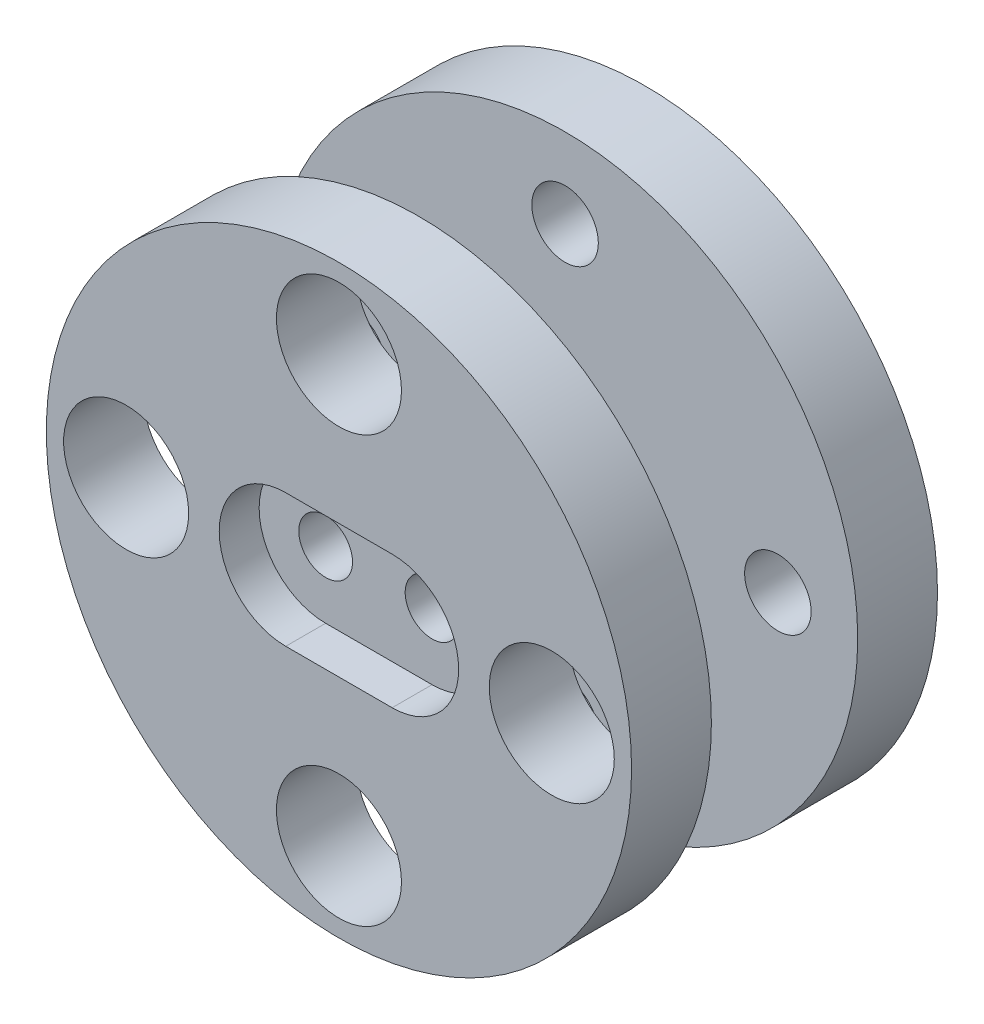
ISO-10303-21;
HEADER;
FILE_DESCRIPTION(('STEP AP214'),'2;1');
FILE_NAME('part.step','',(''),(''),'','','');
FILE_SCHEMA(('AUTOMOTIVE_DESIGN { 1 0 10303 214 1 1 1 1 }'));
ENDSEC;
DATA;
#1=APPLICATION_CONTEXT('core data for automotive mechanical design processes');
#2=APPLICATION_PROTOCOL_DEFINITION('international standard','automotive_design',2000,#1);
#3=PRODUCT_CONTEXT('',#1,'mechanical');
#4=PRODUCT('Part','Part','',(#3));
#5=PRODUCT_RELATED_PRODUCT_CATEGORY('part','',(#4));
#6=PRODUCT_DEFINITION_FORMATION('','',#4);
#7=PRODUCT_DEFINITION_CONTEXT('part definition',#1,'design');
#8=PRODUCT_DEFINITION('design','',#6,#7);
#9=PRODUCT_DEFINITION_SHAPE('','',#8);
#10=(LENGTH_UNIT() NAMED_UNIT(*) SI_UNIT(.MILLI.,.METRE.));
#11=(NAMED_UNIT(*) PLANE_ANGLE_UNIT() SI_UNIT($,.RADIAN.));
#12=(NAMED_UNIT(*) SI_UNIT($,.STERADIAN.) SOLID_ANGLE_UNIT());
#13=UNCERTAINTY_MEASURE_WITH_UNIT(LENGTH_MEASURE(1.E-05),#10,'distance_accuracy_value','');
#14=(GEOMETRIC_REPRESENTATION_CONTEXT(3) GLOBAL_UNCERTAINTY_ASSIGNED_CONTEXT((#13)) GLOBAL_UNIT_ASSIGNED_CONTEXT((#10,
#11,#12)) REPRESENTATION_CONTEXT('',''));
#15=CARTESIAN_POINT('',(0.,0.,0.));
#16=DIRECTION('',(0.,0.,1.));
#17=DIRECTION('',(1.,0.,0.));
#18=AXIS2_PLACEMENT_3D('',#15,#16,#17);
#19=CARTESIAN_POINT('',(2.,0.,0.143288604006347));
#20=DIRECTION('',(0.,0.,1.));
#21=DIRECTION('',(1.,0.,0.));
#22=AXIS2_PLACEMENT_3D('',#19,#20,#21);
#23=CYLINDRICAL_SURFACE('',#22,1.01);
#24=CARTESIAN_POINT('',(2.,0.,8.5));
#25=DIRECTION('',(0.,0.,1.));
#26=DIRECTION('',(1.,0.,0.));
#27=AXIS2_PLACEMENT_3D('',#24,#25,#26);
#28=CIRCLE('',#27,1.01);
#29=CARTESIAN_POINT('',(3.01,0.,8.5));
#30=VERTEX_POINT('',#29);
#31=EDGE_CURVE('E125',#30,#30,#28,.T.);
#32=ORIENTED_EDGE('',*,*,#31,.F.);
#33=EDGE_LOOP('',(#32));
#34=FACE_BOUND('',#33,.T.);
#35=CARTESIAN_POINT('',(2.,0.,10.));
#36=DIRECTION('',(0.,0.,1.));
#37=DIRECTION('',(1.,0.,0.));
#38=AXIS2_PLACEMENT_3D('',#35,#36,#37);
#39=CIRCLE('',#38,1.01);
#40=CARTESIAN_POINT('',(3.01,0.,10.));
#41=VERTEX_POINT('',#40);
#42=EDGE_CURVE('E122',#41,#41,#39,.F.);
#43=ORIENTED_EDGE('',*,*,#42,.F.);
#44=EDGE_LOOP('',(#43));
#45=FACE_BOUND('',#44,.T.);
#46=ADVANCED_FACE('F44',(#34,#45),#23,.F.);
#47=CARTESIAN_POINT('',(-2.,0.,0.143288604006347));
#48=DIRECTION('',(0.,0.,1.));
#49=DIRECTION('',(1.,0.,0.));
#50=AXIS2_PLACEMENT_3D('',#47,#48,#49);
#51=CYLINDRICAL_SURFACE('',#50,1.01);
#52=CARTESIAN_POINT('',(-2.,0.,8.5));
#53=DIRECTION('',(0.,0.,1.));
#54=DIRECTION('',(1.,0.,0.));
#55=AXIS2_PLACEMENT_3D('',#52,#53,#54);
#56=CIRCLE('',#55,1.01);
#57=CARTESIAN_POINT('',(-0.99,0.,8.5));
#58=VERTEX_POINT('',#57);
#59=EDGE_CURVE('E133',#58,#58,#56,.T.);
#60=ORIENTED_EDGE('',*,*,#59,.F.);
#61=EDGE_LOOP('',(#60));
#62=FACE_BOUND('',#61,.T.);
#63=CARTESIAN_POINT('',(-2.,0.,10.));
#64=DIRECTION('',(0.,0.,1.));
#65=DIRECTION('',(1.,0.,0.));
#66=AXIS2_PLACEMENT_3D('',#63,#64,#65);
#67=CIRCLE('',#66,1.01);
#68=CARTESIAN_POINT('',(-0.99,0.,10.));
#69=VERTEX_POINT('',#68);
#70=EDGE_CURVE('E48',#69,#69,#67,.F.);
#71=ORIENTED_EDGE('',*,*,#70,.F.);
#72=EDGE_LOOP('',(#71));
#73=FACE_BOUND('',#72,.T.);
#74=ADVANCED_FACE('F160',(#62,#73),#51,.F.);
#75=CARTESIAN_POINT('',(0.,0.,11.5));
#76=DIRECTION('',(0.,0.,1.));
#77=DIRECTION('',(1.,0.,0.));
#78=AXIS2_PLACEMENT_3D('',#75,#76,#77);
#79=PLANE('',#78);
#80=CARTESIAN_POINT('',(-2.,0.,11.5));
#81=DIRECTION('',(0.,0.,1.));
#82=DIRECTION('',(1.,0.,0.));
#83=AXIS2_PLACEMENT_3D('',#80,#81,#82);
#84=CIRCLE('',#83,2.5);
#85=CARTESIAN_POINT('',(-2.,2.5,11.5));
#86=VERTEX_POINT('',#85);
#87=CARTESIAN_POINT('',(-2.,-2.5,11.5));
#88=VERTEX_POINT('',#87);
#89=EDGE_CURVE('E61',#86,#88,#84,.T.);
#90=ORIENTED_EDGE('',*,*,#89,.F.);
#91=DIRECTION('',(-1.,0.,0.));
#92=VECTOR('',#91,1.);
#93=CARTESIAN_POINT('',(-2.,2.5,11.5));
#94=LINE('',#93,#92);
#95=CARTESIAN_POINT('',(2.,2.5,11.5));
#96=VERTEX_POINT('',#95);
#97=EDGE_CURVE('E110',#96,#86,#94,.T.);
#98=ORIENTED_EDGE('',*,*,#97,.F.);
#99=CARTESIAN_POINT('',(2.,0.,11.5));
#100=DIRECTION('',(0.,0.,1.));
#101=DIRECTION('',(1.,0.,0.));
#102=AXIS2_PLACEMENT_3D('',#99,#100,#101);
#103=CIRCLE('',#102,2.5);
#104=CARTESIAN_POINT('',(2.,-2.5,11.5));
#105=VERTEX_POINT('',#104);
#106=EDGE_CURVE('E94',#105,#96,#103,.T.);
#107=ORIENTED_EDGE('',*,*,#106,.F.);
#108=DIRECTION('',(1.,0.,0.));
#109=VECTOR('',#108,1.);
#110=CARTESIAN_POINT('',(-2.,-2.5,11.5));
#111=LINE('',#110,#109);
#112=EDGE_CURVE('E103',#88,#105,#111,.T.);
#113=ORIENTED_EDGE('',*,*,#112,.F.);
#114=EDGE_LOOP('',(#90,#98,#107,#113));
#115=FACE_BOUND('',#114,.T.);
#116=CARTESIAN_POINT('',(8.,0.,11.5));
#117=DIRECTION('',(0.,0.,1.));
#118=DIRECTION('',(1.,0.,0.));
#119=AXIS2_PLACEMENT_3D('',#116,#117,#118);
#120=CIRCLE('',#119,2.35);
#121=CARTESIAN_POINT('',(10.35,0.,11.5));
#122=VERTEX_POINT('',#121);
#123=EDGE_CURVE('E134',#122,#122,#120,.T.);
#124=ORIENTED_EDGE('',*,*,#123,.F.);
#125=EDGE_LOOP('',(#124));
#126=FACE_BOUND('',#125,.T.);
#127=CARTESIAN_POINT('',(-8.,0.,11.5));
#128=DIRECTION('',(0.,0.,1.));
#129=DIRECTION('',(1.,0.,0.));
#130=AXIS2_PLACEMENT_3D('',#127,#128,#129);
#131=CIRCLE('',#130,2.35);
#132=CARTESIAN_POINT('',(-5.65,0.,11.5));
#133=VERTEX_POINT('',#132);
#134=EDGE_CURVE('E146',#133,#133,#131,.T.);
#135=ORIENTED_EDGE('',*,*,#134,.F.);
#136=EDGE_LOOP('',(#135));
#137=FACE_BOUND('',#136,.T.);
#138=CARTESIAN_POINT('',(0.,0.,11.5));
#139=DIRECTION('',(0.,0.,1.));
#140=DIRECTION('',(1.,0.,0.));
#141=AXIS2_PLACEMENT_3D('',#138,#139,#140);
#142=CIRCLE('',#141,11.);
#143=CARTESIAN_POINT('',(11.,0.,11.5));
#144=VERTEX_POINT('',#143);
#145=EDGE_CURVE('E12',#144,#144,#142,.T.);
#146=ORIENTED_EDGE('',*,*,#145,.T.);
#147=EDGE_LOOP('',(#146));
#148=FACE_BOUND('',#147,.T.);
#149=CARTESIAN_POINT('',(0.,8.,11.5));
#150=DIRECTION('',(0.,0.,1.));
#151=DIRECTION('',(1.,0.,0.));
#152=AXIS2_PLACEMENT_3D('',#149,#150,#151);
#153=CIRCLE('',#152,2.35);
#154=CARTESIAN_POINT('',(2.35,8.,11.5));
#155=VERTEX_POINT('',#154);
#156=EDGE_CURVE('E140',#155,#155,#153,.T.);
#157=ORIENTED_EDGE('',*,*,#156,.F.);
#158=EDGE_LOOP('',(#157));
#159=FACE_BOUND('',#158,.T.);
#160=CARTESIAN_POINT('',(0.,-8.,11.5));
#161=DIRECTION('',(0.,0.,1.));
#162=DIRECTION('',(1.,0.,0.));
#163=AXIS2_PLACEMENT_3D('',#160,#161,#162);
#164=CIRCLE('',#163,2.35);
#165=CARTESIAN_POINT('',(2.35,-8.,11.5));
#166=VERTEX_POINT('',#165);
#167=EDGE_CURVE('E126',#166,#166,#164,.T.);
#168=ORIENTED_EDGE('',*,*,#167,.F.);
#169=EDGE_LOOP('',(#168));
#170=FACE_BOUND('',#169,.T.);
#171=ADVANCED_FACE('F107',(#115,#126,#137,#148,#159,#170),#79,.T.);
#172=CARTESIAN_POINT('',(0.,0.,8.5));
#173=DIRECTION('',(0.,0.,1.));
#174=DIRECTION('',(1.,0.,0.));
#175=AXIS2_PLACEMENT_3D('',#172,#173,#174);
#176=PLANE('',#175);
#177=ORIENTED_EDGE('',*,*,#59,.T.);
#178=EDGE_LOOP('',(#177));
#179=FACE_BOUND('',#178,.T.);
#180=ORIENTED_EDGE('',*,*,#31,.T.);
#181=EDGE_LOOP('',(#180));
#182=FACE_BOUND('',#181,.T.);
#183=CARTESIAN_POINT('',(0.,0.,8.5));
#184=DIRECTION('',(0.,0.,1.));
#185=DIRECTION('',(1.,0.,0.));
#186=AXIS2_PLACEMENT_3D('',#183,#184,#185);
#187=CIRCLE('',#186,11.);
#188=CARTESIAN_POINT('',(11.,0.,8.5));
#189=VERTEX_POINT('',#188);
#190=EDGE_CURVE('E53',#189,#189,#187,.T.);
#191=ORIENTED_EDGE('',*,*,#190,.F.);
#192=EDGE_LOOP('',(#191));
#193=FACE_BOUND('',#192,.T.);
#194=CARTESIAN_POINT('',(-8.,0.,8.5));
#195=DIRECTION('',(0.,0.,1.));
#196=DIRECTION('',(1.,0.,0.));
#197=AXIS2_PLACEMENT_3D('',#194,#195,#196);
#198=CIRCLE('',#197,2.35);
#199=CARTESIAN_POINT('',(-5.65,0.,8.5));
#200=VERTEX_POINT('',#199);
#201=EDGE_CURVE('E143',#200,#200,#198,.T.);
#202=ORIENTED_EDGE('',*,*,#201,.T.);
#203=EDGE_LOOP('',(#202));
#204=FACE_BOUND('',#203,.T.);
#205=CARTESIAN_POINT('',(0.,8.,8.5));
#206=DIRECTION('',(0.,0.,1.));
#207=DIRECTION('',(1.,0.,0.));
#208=AXIS2_PLACEMENT_3D('',#205,#206,#207);
#209=CIRCLE('',#208,2.35);
#210=CARTESIAN_POINT('',(2.35,8.,8.5));
#211=VERTEX_POINT('',#210);
#212=EDGE_CURVE('E137',#211,#211,#209,.T.);
#213=ORIENTED_EDGE('',*,*,#212,.T.);
#214=EDGE_LOOP('',(#213));
#215=FACE_BOUND('',#214,.T.);
#216=CARTESIAN_POINT('',(8.,0.,8.5));
#217=DIRECTION('',(0.,0.,1.));
#218=DIRECTION('',(1.,0.,0.));
#219=AXIS2_PLACEMENT_3D('',#216,#217,#218);
#220=CIRCLE('',#219,2.35);
#221=CARTESIAN_POINT('',(10.35,0.,8.5));
#222=VERTEX_POINT('',#221);
#223=EDGE_CURVE('E129',#222,#222,#220,.T.);
#224=ORIENTED_EDGE('',*,*,#223,.T.);
#225=EDGE_LOOP('',(#224));
#226=FACE_BOUND('',#225,.T.);
#227=CARTESIAN_POINT('',(0.,-8.,8.5));
#228=DIRECTION('',(0.,0.,1.));
#229=DIRECTION('',(1.,0.,0.));
#230=AXIS2_PLACEMENT_3D('',#227,#228,#229);
#231=CIRCLE('',#230,2.35);
#232=CARTESIAN_POINT('',(2.35,-8.,8.5));
#233=VERTEX_POINT('',#232);
#234=EDGE_CURVE('E130',#233,#233,#231,.T.);
#235=ORIENTED_EDGE('',*,*,#234,.T.);
#236=EDGE_LOOP('',(#235));
#237=FACE_BOUND('',#236,.T.);
#238=ADVANCED_FACE('F157',(#179,#182,#193,#204,#215,#226,#237),#176,.F.);
#239=CARTESIAN_POINT('',(0.,0.,11.5));
#240=DIRECTION('',(0.,0.,-1.));
#241=DIRECTION('',(-1.,0.,0.));
#242=AXIS2_PLACEMENT_3D('',#239,#240,#241);
#243=CYLINDRICAL_SURFACE('',#242,11.);
#244=ORIENTED_EDGE('',*,*,#145,.F.);
#245=EDGE_LOOP('',(#244));
#246=FACE_BOUND('',#245,.T.);
#247=ORIENTED_EDGE('',*,*,#190,.T.);
#248=EDGE_LOOP('',(#247));
#249=FACE_BOUND('',#248,.T.);
#250=ADVANCED_FACE('F46',(#246,#249),#243,.T.);
#251=CARTESIAN_POINT('',(-8.,0.,11.5));
#252=DIRECTION('',(0.,0.,-1.));
#253=DIRECTION('',(-1.,0.,0.));
#254=AXIS2_PLACEMENT_3D('',#251,#252,#253);
#255=CYLINDRICAL_SURFACE('',#254,2.35);
#256=ORIENTED_EDGE('',*,*,#134,.T.);
#257=EDGE_LOOP('',(#256));
#258=FACE_BOUND('',#257,.T.);
#259=ORIENTED_EDGE('',*,*,#201,.F.);
#260=EDGE_LOOP('',(#259));
#261=FACE_BOUND('',#260,.T.);
#262=ADVANCED_FACE('F194',(#258,#261),#255,.F.);
#263=CARTESIAN_POINT('',(0.,8.,11.5));
#264=DIRECTION('',(0.,0.,-1.));
#265=DIRECTION('',(-1.,0.,0.));
#266=AXIS2_PLACEMENT_3D('',#263,#264,#265);
#267=CYLINDRICAL_SURFACE('',#266,2.35);
#268=ORIENTED_EDGE('',*,*,#156,.T.);
#269=EDGE_LOOP('',(#268));
#270=FACE_BOUND('',#269,.T.);
#271=ORIENTED_EDGE('',*,*,#212,.F.);
#272=EDGE_LOOP('',(#271));
#273=FACE_BOUND('',#272,.T.);
#274=ADVANCED_FACE('F190',(#270,#273),#267,.F.);
#275=CARTESIAN_POINT('',(8.,0.,11.5));
#276=DIRECTION('',(0.,0.,-1.));
#277=DIRECTION('',(-1.,0.,0.));
#278=AXIS2_PLACEMENT_3D('',#275,#276,#277);
#279=CYLINDRICAL_SURFACE('',#278,2.35);
#280=ORIENTED_EDGE('',*,*,#123,.T.);
#281=EDGE_LOOP('',(#280));
#282=FACE_BOUND('',#281,.T.);
#283=ORIENTED_EDGE('',*,*,#223,.F.);
#284=EDGE_LOOP('',(#283));
#285=FACE_BOUND('',#284,.T.);
#286=ADVANCED_FACE('F186',(#282,#285),#279,.F.);
#287=CARTESIAN_POINT('',(0.,-8.,11.5));
#288=DIRECTION('',(0.,0.,-1.));
#289=DIRECTION('',(-1.,0.,0.));
#290=AXIS2_PLACEMENT_3D('',#287,#288,#289);
#291=CYLINDRICAL_SURFACE('',#290,2.35);
#292=ORIENTED_EDGE('',*,*,#167,.T.);
#293=EDGE_LOOP('',(#292));
#294=FACE_BOUND('',#293,.T.);
#295=ORIENTED_EDGE('',*,*,#234,.F.);
#296=EDGE_LOOP('',(#295));
#297=FACE_BOUND('',#296,.T.);
#298=ADVANCED_FACE('F171',(#294,#297),#291,.F.);
#299=CARTESIAN_POINT('',(0.,0.,10.));
#300=DIRECTION('',(0.,0.,1.));
#301=DIRECTION('',(1.,0.,0.));
#302=AXIS2_PLACEMENT_3D('',#299,#300,#301);
#303=PLANE('',#302);
#304=CARTESIAN_POINT('',(-2.,0.,10.));
#305=DIRECTION('',(0.,0.,1.));
#306=DIRECTION('',(1.,0.,0.));
#307=AXIS2_PLACEMENT_3D('',#304,#305,#306);
#308=CIRCLE('',#307,2.5);
#309=CARTESIAN_POINT('',(-2.,-2.5,10.));
#310=VERTEX_POINT('',#309);
#311=CARTESIAN_POINT('',(-2.,2.5,10.));
#312=VERTEX_POINT('',#311);
#313=EDGE_CURVE('E121',#310,#312,#308,.F.);
#314=ORIENTED_EDGE('',*,*,#313,.F.);
#315=DIRECTION('',(-1.,0.,0.));
#316=VECTOR('',#315,1.);
#317=CARTESIAN_POINT('',(-2.,-2.5,10.));
#318=LINE('',#317,#316);
#319=CARTESIAN_POINT('',(2.,-2.5,10.));
#320=VERTEX_POINT('',#319);
#321=EDGE_CURVE('E119',#320,#310,#318,.T.);
#322=ORIENTED_EDGE('',*,*,#321,.F.);
#323=CARTESIAN_POINT('',(2.,0.,10.));
#324=DIRECTION('',(0.,0.,1.));
#325=DIRECTION('',(1.,0.,0.));
#326=AXIS2_PLACEMENT_3D('',#323,#324,#325);
#327=CIRCLE('',#326,2.5);
#328=CARTESIAN_POINT('',(2.,2.5,10.));
#329=VERTEX_POINT('',#328);
#330=EDGE_CURVE('E96',#329,#320,#327,.F.);
#331=ORIENTED_EDGE('',*,*,#330,.F.);
#332=DIRECTION('',(1.,0.,0.));
#333=VECTOR('',#332,1.);
#334=CARTESIAN_POINT('',(-2.,2.5,10.));
#335=LINE('',#334,#333);
#336=EDGE_CURVE('E70',#312,#329,#335,.T.);
#337=ORIENTED_EDGE('',*,*,#336,.F.);
#338=EDGE_LOOP('',(#314,#322,#331,#337));
#339=FACE_BOUND('',#338,.T.);
#340=ORIENTED_EDGE('',*,*,#70,.T.);
#341=EDGE_LOOP('',(#340));
#342=FACE_BOUND('',#341,.T.);
#343=ORIENTED_EDGE('',*,*,#42,.T.);
#344=EDGE_LOOP('',(#343));
#345=FACE_BOUND('',#344,.T.);
#346=ADVANCED_FACE('F167',(#339,#342,#345),#303,.T.);
#347=CARTESIAN_POINT('',(-2.,0.,-10.295630140987));
#348=DIRECTION('',(0.,0.,1.));
#349=DIRECTION('',(1.,0.,0.));
#350=AXIS2_PLACEMENT_3D('',#347,#348,#349);
#351=CYLINDRICAL_SURFACE('',#350,2.5);
#352=ORIENTED_EDGE('',*,*,#313,.T.);
#353=DIRECTION('',(0.,0.,1.));
#354=VECTOR('',#353,1.);
#355=CARTESIAN_POINT('',(-2.,2.5,-10.295630140987));
#356=LINE('',#355,#354);
#357=EDGE_CURVE('E115',#312,#86,#356,.T.);
#358=ORIENTED_EDGE('',*,*,#357,.T.);
#359=ORIENTED_EDGE('',*,*,#89,.T.);
#360=DIRECTION('',(0.,0.,1.));
#361=VECTOR('',#360,1.);
#362=CARTESIAN_POINT('',(-2.,-2.5,-10.295630140987));
#363=LINE('',#362,#361);
#364=EDGE_CURVE('E100',#310,#88,#363,.T.);
#365=ORIENTED_EDGE('',*,*,#364,.F.);
#366=EDGE_LOOP('',(#352,#358,#359,#365));
#367=FACE_BOUND('',#366,.T.);
#368=ADVANCED_FACE('F170',(#367),#351,.F.);
#369=CARTESIAN_POINT('',(-2.,2.5,-10.295630140987));
#370=DIRECTION('',(0.,1.,0.));
#371=DIRECTION('',(0.,0.,1.));
#372=AXIS2_PLACEMENT_3D('',#369,#370,#371);
#373=PLANE('',#372);
#374=ORIENTED_EDGE('',*,*,#336,.T.);
#375=DIRECTION('',(0.,0.,1.));
#376=VECTOR('',#375,1.);
#377=CARTESIAN_POINT('',(2.,2.5,-10.295630140987));
#378=LINE('',#377,#376);
#379=EDGE_CURVE('E99',#329,#96,#378,.T.);
#380=ORIENTED_EDGE('',*,*,#379,.T.);
#381=ORIENTED_EDGE('',*,*,#97,.T.);
#382=ORIENTED_EDGE('',*,*,#357,.F.);
#383=EDGE_LOOP('',(#374,#380,#381,#382));
#384=FACE_BOUND('',#383,.T.);
#385=ADVANCED_FACE('F255',(#384),#373,.F.);
#386=CARTESIAN_POINT('',(2.,0.,-10.295630140987));
#387=DIRECTION('',(0.,0.,1.));
#388=DIRECTION('',(1.,0.,0.));
#389=AXIS2_PLACEMENT_3D('',#386,#387,#388);
#390=CYLINDRICAL_SURFACE('',#389,2.5);
#391=ORIENTED_EDGE('',*,*,#330,.T.);
#392=DIRECTION('',(0.,0.,1.));
#393=VECTOR('',#392,1.);
#394=CARTESIAN_POINT('',(2.,-2.5,-10.295630140987));
#395=LINE('',#394,#393);
#396=EDGE_CURVE('E89',#320,#105,#395,.T.);
#397=ORIENTED_EDGE('',*,*,#396,.T.);
#398=ORIENTED_EDGE('',*,*,#106,.T.);
#399=ORIENTED_EDGE('',*,*,#379,.F.);
#400=EDGE_LOOP('',(#391,#397,#398,#399));
#401=FACE_BOUND('',#400,.T.);
#402=ADVANCED_FACE('F91',(#401),#390,.F.);
#403=CARTESIAN_POINT('',(-2.,-2.5,-10.295630140987));
#404=DIRECTION('',(0.,-1.,0.));
#405=DIRECTION('',(0.,0.,-1.));
#406=AXIS2_PLACEMENT_3D('',#403,#404,#405);
#407=PLANE('',#406);
#408=ORIENTED_EDGE('',*,*,#321,.T.);
#409=ORIENTED_EDGE('',*,*,#364,.T.);
#410=ORIENTED_EDGE('',*,*,#112,.T.);
#411=ORIENTED_EDGE('',*,*,#396,.F.);
#412=EDGE_LOOP('',(#408,#409,#410,#411));
#413=FACE_BOUND('',#412,.T.);
#414=ADVANCED_FACE('F104',(#413),#407,.F.);
#415=CLOSED_SHELL('',(#46,#74,#171,#238,#250,#262,#274,#286,#298,#346,#368,#385,#402,#414));
#416=MANIFOLD_SOLID_BREP('B2',#415);
#417=CARTESIAN_POINT('',(0.,0.,8.5));
#418=DIRECTION('',(0.,0.,-1.));
#419=DIRECTION('',(-1.,0.,0.));
#420=AXIS2_PLACEMENT_3D('',#417,#418,#419);
#421=CYLINDRICAL_SURFACE('',#420,3.);
#422=CARTESIAN_POINT('',(0.,0.,3.));
#423=DIRECTION('',(0.,0.,1.));
#424=DIRECTION('',(1.,0.,0.));
#425=AXIS2_PLACEMENT_3D('',#422,#423,#424);
#426=CIRCLE('',#425,3.);
#427=CARTESIAN_POINT('',(2.994975,0.173564827586121,3.));
#428=VERTEX_POINT('',#427);
#429=CARTESIAN_POINT('',(-2.994975,0.173564827586118,3.));
#430=VERTEX_POINT('',#429);
#431=EDGE_CURVE('E383',#428,#430,#426,.T.);
#432=ORIENTED_EDGE('',*,*,#431,.T.);
#433=DIRECTION('',(0.,0.,1.));
#434=VECTOR('',#433,1.);
#435=CARTESIAN_POINT('',(-2.994975,0.173564827586118,7.25));
#436=LINE('',#435,#434);
#437=CARTESIAN_POINT('',(-2.994975,0.173564827586118,8.5));
#438=VERTEX_POINT('',#437);
#439=EDGE_CURVE('E355',#430,#438,#436,.T.);
#440=ORIENTED_EDGE('',*,*,#439,.T.);
#441=CARTESIAN_POINT('',(0.,0.,8.5));
#442=DIRECTION('',(0.,0.,1.));
#443=DIRECTION('',(1.,0.,0.));
#444=AXIS2_PLACEMENT_3D('',#441,#442,#443);
#445=CIRCLE('',#444,3.);
#446=CARTESIAN_POINT('',(2.994975,0.173564827586121,8.5));
#447=VERTEX_POINT('',#446);
#448=EDGE_CURVE('E340',#447,#438,#445,.T.);
#449=ORIENTED_EDGE('',*,*,#448,.F.);
#450=DIRECTION('',(0.,0.,1.));
#451=VECTOR('',#450,1.);
#452=CARTESIAN_POINT('',(2.994975,0.173564827586121,7.25));
#453=LINE('',#452,#451);
#454=EDGE_CURVE('E372',#447,#428,#453,.F.);
#455=ORIENTED_EDGE('',*,*,#454,.T.);
#456=EDGE_LOOP('',(#432,#440,#449,#455));
#457=FACE_BOUND('',#456,.T.);
#458=ADVANCED_FACE('F332',(#457),#421,.T.);
#459=CARTESIAN_POINT('',(-2.994975,-0.173564827586119,8.5));
#460=VERTEX_POINT('',#459);
#461=CARTESIAN_POINT('',(2.994975,-0.173564827586116,8.5));
#462=VERTEX_POINT('',#461);
#463=EDGE_CURVE('E387',#460,#462,#445,.T.);
#464=ORIENTED_EDGE('',*,*,#463,.F.);
#465=DIRECTION('',(0.,0.,1.));
#466=VECTOR('',#465,1.);
#467=CARTESIAN_POINT('',(-2.994975,-0.173564827586119,7.25));
#468=LINE('',#467,#466);
#469=CARTESIAN_POINT('',(-2.994975,-0.173564827586119,3.));
#470=VERTEX_POINT('',#469);
#471=EDGE_CURVE('E393',#460,#470,#468,.F.);
#472=ORIENTED_EDGE('',*,*,#471,.T.);
#473=CARTESIAN_POINT('',(2.994975,-0.173564827586116,3.));
#474=VERTEX_POINT('',#473);
#475=EDGE_CURVE('E388',#470,#474,#426,.T.);
#476=ORIENTED_EDGE('',*,*,#475,.T.);
#477=DIRECTION('',(0.,0.,1.));
#478=VECTOR('',#477,1.);
#479=CARTESIAN_POINT('',(2.994975,-0.173564827586116,7.25));
#480=LINE('',#479,#478);
#481=EDGE_CURVE('E347',#474,#462,#480,.T.);
#482=ORIENTED_EDGE('',*,*,#481,.T.);
#483=EDGE_LOOP('',(#464,#472,#476,#482));
#484=FACE_BOUND('',#483,.T.);
#485=ADVANCED_FACE('F334',(#484),#421,.T.);
#486=CARTESIAN_POINT('',(0.,0.,8.5));
#487=DIRECTION('',(0.,0.,1.));
#488=DIRECTION('',(1.,0.,0.));
#489=AXIS2_PLACEMENT_3D('',#486,#487,#488);
#490=PLANE('',#489);
#491=CARTESIAN_POINT('',(-2.,0.,8.5));
#492=DIRECTION('',(0.,0.,1.));
#493=DIRECTION('',(1.,0.,0.));
#494=AXIS2_PLACEMENT_3D('',#491,#492,#493);
#495=CIRCLE('',#494,1.01);
#496=EDGE_CURVE('E396',#460,#438,#495,.T.);
#497=ORIENTED_EDGE('',*,*,#496,.F.);
#498=ORIENTED_EDGE('',*,*,#463,.T.);
#499=CARTESIAN_POINT('',(2.,0.,8.5));
#500=DIRECTION('',(0.,0.,1.));
#501=DIRECTION('',(1.,0.,0.));
#502=AXIS2_PLACEMENT_3D('',#499,#500,#501);
#503=CIRCLE('',#502,1.01);
#504=EDGE_CURVE('E378',#447,#462,#503,.T.);
#505=ORIENTED_EDGE('',*,*,#504,.F.);
#506=ORIENTED_EDGE('',*,*,#448,.T.);
#507=EDGE_LOOP('',(#497,#498,#505,#506));
#508=FACE_BOUND('',#507,.T.);
#509=ADVANCED_FACE('F403',(#508),#490,.T.);
#510=CARTESIAN_POINT('',(0.,0.,3.));
#511=DIRECTION('',(0.,0.,1.));
#512=DIRECTION('',(1.,0.,0.));
#513=AXIS2_PLACEMENT_3D('',#510,#511,#512);
#514=PLANE('',#513);
#515=ORIENTED_EDGE('',*,*,#475,.F.);
#516=CARTESIAN_POINT('',(-2.,0.,3.));
#517=DIRECTION('',(0.,0.,1.));
#518=DIRECTION('',(1.,0.,0.));
#519=AXIS2_PLACEMENT_3D('',#516,#517,#518);
#520=CIRCLE('',#519,1.01);
#521=EDGE_CURVE('E42',#470,#430,#520,.T.);
#522=ORIENTED_EDGE('',*,*,#521,.T.);
#523=ORIENTED_EDGE('',*,*,#431,.F.);
#524=CARTESIAN_POINT('',(2.,0.,3.));
#525=DIRECTION('',(0.,0.,1.));
#526=DIRECTION('',(1.,0.,0.));
#527=AXIS2_PLACEMENT_3D('',#524,#525,#526);
#528=CIRCLE('',#527,1.01);
#529=EDGE_CURVE('E369',#474,#428,#528,.F.);
#530=ORIENTED_EDGE('',*,*,#529,.F.);
#531=EDGE_LOOP('',(#515,#522,#523,#530));
#532=FACE_BOUND('',#531,.T.);
#533=ADVANCED_FACE('F386',(#532),#514,.F.);
#534=CARTESIAN_POINT('',(2.,0.,0.143288604006347));
#535=DIRECTION('',(0.,0.,1.));
#536=DIRECTION('',(1.,0.,0.));
#537=AXIS2_PLACEMENT_3D('',#534,#535,#536);
#538=CYLINDRICAL_SURFACE('',#537,1.01);
#539=ORIENTED_EDGE('',*,*,#529,.T.);
#540=ORIENTED_EDGE('',*,*,#454,.F.);
#541=ORIENTED_EDGE('',*,*,#504,.T.);
#542=ORIENTED_EDGE('',*,*,#481,.F.);
#543=EDGE_LOOP('',(#539,#540,#541,#542));
#544=FACE_BOUND('',#543,.T.);
#545=ADVANCED_FACE('F371',(#544),#538,.F.);
#546=CARTESIAN_POINT('',(-2.,0.,0.143288604006347));
#547=DIRECTION('',(0.,0.,1.));
#548=DIRECTION('',(1.,0.,0.));
#549=AXIS2_PLACEMENT_3D('',#546,#547,#548);
#550=CYLINDRICAL_SURFACE('',#549,1.01);
#551=ORIENTED_EDGE('',*,*,#521,.F.);
#552=ORIENTED_EDGE('',*,*,#471,.F.);
#553=ORIENTED_EDGE('',*,*,#496,.T.);
#554=ORIENTED_EDGE('',*,*,#439,.F.);
#555=EDGE_LOOP('',(#551,#552,#553,#554));
#556=FACE_BOUND('',#555,.T.);
#557=ADVANCED_FACE('F404',(#556),#550,.F.);
#558=CLOSED_SHELL('',(#458,#485,#509,#533,#545,#557));
#559=MANIFOLD_SOLID_BREP('B6',#558);
#560=CARTESIAN_POINT('',(0.,0.,3.));
#561=DIRECTION('',(0.,0.,1.));
#562=DIRECTION('',(1.,0.,0.));
#563=AXIS2_PLACEMENT_3D('',#560,#561,#562);
#564=PLANE('',#563);
#565=CARTESIAN_POINT('',(-2.,0.,3.));
#566=DIRECTION('',(0.,0.,1.));
#567=DIRECTION('',(1.,0.,0.));
#568=AXIS2_PLACEMENT_3D('',#565,#566,#567);
#569=CIRCLE('',#568,0.8);
#570=CARTESIAN_POINT('',(-1.2,0.,3.));
#571=VERTEX_POINT('',#570);
#572=EDGE_CURVE('E494',#571,#571,#569,.T.);
#573=ORIENTED_EDGE('',*,*,#572,.F.);
#574=EDGE_LOOP('',(#573));
#575=FACE_BOUND('',#574,.T.);
#576=CARTESIAN_POINT('',(2.,0.,3.));
#577=DIRECTION('',(0.,0.,1.));
#578=DIRECTION('',(1.,0.,0.));
#579=AXIS2_PLACEMENT_3D('',#576,#577,#578);
#580=CIRCLE('',#579,0.8);
#581=CARTESIAN_POINT('',(2.8,0.,3.));
#582=VERTEX_POINT('',#581);
#583=EDGE_CURVE('E495',#582,#582,#580,.T.);
#584=ORIENTED_EDGE('',*,*,#583,.F.);
#585=EDGE_LOOP('',(#584));
#586=FACE_BOUND('',#585,.T.);
#587=CARTESIAN_POINT('',(8.,0.,3.));
#588=DIRECTION('',(0.,0.,1.));
#589=DIRECTION('',(1.,0.,0.));
#590=AXIS2_PLACEMENT_3D('',#587,#588,#589);
#591=CIRCLE('',#590,1.25);
#592=CARTESIAN_POINT('',(9.25,0.,3.));
#593=VERTEX_POINT('',#592);
#594=EDGE_CURVE('E476',#593,#593,#591,.T.);
#595=ORIENTED_EDGE('',*,*,#594,.F.);
#596=EDGE_LOOP('',(#595));
#597=FACE_BOUND('',#596,.T.);
#598=CARTESIAN_POINT('',(-8.,0.,3.));
#599=DIRECTION('',(0.,0.,1.));
#600=DIRECTION('',(1.,0.,0.));
#601=AXIS2_PLACEMENT_3D('',#598,#599,#600);
#602=CIRCLE('',#601,1.25);
#603=CARTESIAN_POINT('',(-6.75,0.,3.));
#604=VERTEX_POINT('',#603);
#605=EDGE_CURVE('E465',#604,#604,#602,.T.);
#606=ORIENTED_EDGE('',*,*,#605,.F.);
#607=EDGE_LOOP('',(#606));
#608=FACE_BOUND('',#607,.T.);
#609=CARTESIAN_POINT('',(0.,0.,3.));
#610=DIRECTION('',(0.,0.,1.));
#611=DIRECTION('',(1.,0.,0.));
#612=AXIS2_PLACEMENT_3D('',#609,#610,#611);
#613=CIRCLE('',#612,11.);
#614=CARTESIAN_POINT('',(11.,0.,3.));
#615=VERTEX_POINT('',#614);
#616=EDGE_CURVE('E331',#615,#615,#613,.T.);
#617=ORIENTED_EDGE('',*,*,#616,.T.);
#618=EDGE_LOOP('',(#617));
#619=FACE_BOUND('',#618,.T.);
#620=CARTESIAN_POINT('',(0.,8.,3.));
#621=DIRECTION('',(0.,0.,1.));
#622=DIRECTION('',(1.,0.,0.));
#623=AXIS2_PLACEMENT_3D('',#620,#621,#622);
#624=CIRCLE('',#623,1.25);
#625=CARTESIAN_POINT('',(1.25,8.,3.));
#626=VERTEX_POINT('',#625);
#627=EDGE_CURVE('E470',#626,#626,#624,.T.);
#628=ORIENTED_EDGE('',*,*,#627,.F.);
#629=EDGE_LOOP('',(#628));
#630=FACE_BOUND('',#629,.T.);
#631=CARTESIAN_POINT('',(0.,-8.,3.));
#632=DIRECTION('',(0.,0.,1.));
#633=DIRECTION('',(1.,0.,0.));
#634=AXIS2_PLACEMENT_3D('',#631,#632,#633);
#635=CIRCLE('',#634,1.25);
#636=CARTESIAN_POINT('',(1.25,-8.,3.));
#637=VERTEX_POINT('',#636);
#638=EDGE_CURVE('E482',#637,#637,#635,.T.);
#639=ORIENTED_EDGE('',*,*,#638,.F.);
#640=EDGE_LOOP('',(#639));
#641=FACE_BOUND('',#640,.T.);
#642=ADVANCED_FACE('F454',(#575,#586,#597,#608,#619,#630,#641),#564,.T.);
#643=CARTESIAN_POINT('',(0.,0.,0.));
#644=DIRECTION('',(0.,0.,1.));
#645=DIRECTION('',(1.,0.,0.));
#646=AXIS2_PLACEMENT_3D('',#643,#644,#645);
#647=PLANE('',#646);
#648=CARTESIAN_POINT('',(-2.,0.,0.));
#649=DIRECTION('',(0.,0.,1.));
#650=DIRECTION('',(1.,0.,0.));
#651=AXIS2_PLACEMENT_3D('',#648,#649,#650);
#652=CIRCLE('',#651,0.8);
#653=CARTESIAN_POINT('',(-1.2,0.,0.));
#654=VERTEX_POINT('',#653);
#655=EDGE_CURVE('E488',#654,#654,#652,.F.);
#656=ORIENTED_EDGE('',*,*,#655,.F.);
#657=EDGE_LOOP('',(#656));
#658=FACE_BOUND('',#657,.T.);
#659=CARTESIAN_POINT('',(2.,0.,0.));
#660=DIRECTION('',(0.,0.,1.));
#661=DIRECTION('',(1.,0.,0.));
#662=AXIS2_PLACEMENT_3D('',#659,#660,#661);
#663=CIRCLE('',#662,0.8);
#664=CARTESIAN_POINT('',(2.8,0.,0.));
#665=VERTEX_POINT('',#664);
#666=EDGE_CURVE('E491',#665,#665,#663,.F.);
#667=ORIENTED_EDGE('',*,*,#666,.F.);
#668=EDGE_LOOP('',(#667));
#669=FACE_BOUND('',#668,.T.);
#670=CARTESIAN_POINT('',(0.,0.,0.));
#671=DIRECTION('',(0.,0.,1.));
#672=DIRECTION('',(1.,0.,0.));
#673=AXIS2_PLACEMENT_3D('',#670,#671,#672);
#674=CIRCLE('',#673,11.);
#675=CARTESIAN_POINT('',(11.,0.,0.));
#676=VERTEX_POINT('',#675);
#677=EDGE_CURVE('E458',#676,#676,#674,.T.);
#678=ORIENTED_EDGE('',*,*,#677,.F.);
#679=EDGE_LOOP('',(#678));
#680=FACE_BOUND('',#679,.T.);
#681=CARTESIAN_POINT('',(-8.,0.,0.));
#682=DIRECTION('',(0.,0.,1.));
#683=DIRECTION('',(1.,0.,0.));
#684=AXIS2_PLACEMENT_3D('',#681,#682,#683);
#685=CIRCLE('',#684,1.25);
#686=CARTESIAN_POINT('',(-6.75,0.,0.));
#687=VERTEX_POINT('',#686);
#688=EDGE_CURVE('E467',#687,#687,#685,.T.);
#689=ORIENTED_EDGE('',*,*,#688,.T.);
#690=EDGE_LOOP('',(#689));
#691=FACE_BOUND('',#690,.T.);
#692=CARTESIAN_POINT('',(0.,8.,0.));
#693=DIRECTION('',(0.,0.,1.));
#694=DIRECTION('',(1.,0.,0.));
#695=AXIS2_PLACEMENT_3D('',#692,#693,#694);
#696=CIRCLE('',#695,1.25);
#697=CARTESIAN_POINT('',(1.25,8.,0.));
#698=VERTEX_POINT('',#697);
#699=EDGE_CURVE('E473',#698,#698,#696,.T.);
#700=ORIENTED_EDGE('',*,*,#699,.T.);
#701=EDGE_LOOP('',(#700));
#702=FACE_BOUND('',#701,.T.);
#703=CARTESIAN_POINT('',(8.,0.,0.));
#704=DIRECTION('',(0.,0.,1.));
#705=DIRECTION('',(1.,0.,0.));
#706=AXIS2_PLACEMENT_3D('',#703,#704,#705);
#707=CIRCLE('',#706,1.25);
#708=CARTESIAN_POINT('',(9.25,0.,0.));
#709=VERTEX_POINT('',#708);
#710=EDGE_CURVE('E479',#709,#709,#707,.T.);
#711=ORIENTED_EDGE('',*,*,#710,.T.);
#712=EDGE_LOOP('',(#711));
#713=FACE_BOUND('',#712,.T.);
#714=CARTESIAN_POINT('',(0.,-8.,0.));
#715=DIRECTION('',(0.,0.,1.));
#716=DIRECTION('',(1.,0.,0.));
#717=AXIS2_PLACEMENT_3D('',#714,#715,#716);
#718=CIRCLE('',#717,1.25);
#719=CARTESIAN_POINT('',(1.25,-8.,0.));
#720=VERTEX_POINT('',#719);
#721=EDGE_CURVE('E485',#720,#720,#718,.T.);
#722=ORIENTED_EDGE('',*,*,#721,.T.);
#723=EDGE_LOOP('',(#722));
#724=FACE_BOUND('',#723,.T.);
#725=ADVANCED_FACE('F507',(#658,#669,#680,#691,#702,#713,#724),#647,.F.);
#726=CARTESIAN_POINT('',(0.,0.,3.));
#727=DIRECTION('',(0.,0.,-1.));
#728=DIRECTION('',(-1.,0.,0.));
#729=AXIS2_PLACEMENT_3D('',#726,#727,#728);
#730=CYLINDRICAL_SURFACE('',#729,11.);
#731=ORIENTED_EDGE('',*,*,#616,.F.);
#732=EDGE_LOOP('',(#731));
#733=FACE_BOUND('',#732,.T.);
#734=ORIENTED_EDGE('',*,*,#677,.T.);
#735=EDGE_LOOP('',(#734));
#736=FACE_BOUND('',#735,.T.);
#737=ADVANCED_FACE('F456',(#733,#736),#730,.T.);
#738=CARTESIAN_POINT('',(-8.,0.,3.));
#739=DIRECTION('',(0.,0.,-1.));
#740=DIRECTION('',(-1.,0.,0.));
#741=AXIS2_PLACEMENT_3D('',#738,#739,#740);
#742=CYLINDRICAL_SURFACE('',#741,1.25);
#743=ORIENTED_EDGE('',*,*,#605,.T.);
#744=EDGE_LOOP('',(#743));
#745=FACE_BOUND('',#744,.T.);
#746=ORIENTED_EDGE('',*,*,#688,.F.);
#747=EDGE_LOOP('',(#746));
#748=FACE_BOUND('',#747,.T.);
#749=ADVANCED_FACE('F532',(#745,#748),#742,.F.);
#750=CARTESIAN_POINT('',(0.,8.,3.));
#751=DIRECTION('',(0.,0.,-1.));
#752=DIRECTION('',(-1.,0.,0.));
#753=AXIS2_PLACEMENT_3D('',#750,#751,#752);
#754=CYLINDRICAL_SURFACE('',#753,1.25);
#755=ORIENTED_EDGE('',*,*,#627,.T.);
#756=EDGE_LOOP('',(#755));
#757=FACE_BOUND('',#756,.T.);
#758=ORIENTED_EDGE('',*,*,#699,.F.);
#759=EDGE_LOOP('',(#758));
#760=FACE_BOUND('',#759,.T.);
#761=ADVANCED_FACE('F539',(#757,#760),#754,.F.);
#762=CARTESIAN_POINT('',(8.,0.,3.));
#763=DIRECTION('',(0.,0.,-1.));
#764=DIRECTION('',(-1.,0.,0.));
#765=AXIS2_PLACEMENT_3D('',#762,#763,#764);
#766=CYLINDRICAL_SURFACE('',#765,1.25);
#767=ORIENTED_EDGE('',*,*,#594,.T.);
#768=EDGE_LOOP('',(#767));
#769=FACE_BOUND('',#768,.T.);
#770=ORIENTED_EDGE('',*,*,#710,.F.);
#771=EDGE_LOOP('',(#770));
#772=FACE_BOUND('',#771,.T.);
#773=ADVANCED_FACE('F523',(#769,#772),#766,.F.);
#774=CARTESIAN_POINT('',(0.,-8.,3.));
#775=DIRECTION('',(0.,0.,-1.));
#776=DIRECTION('',(-1.,0.,0.));
#777=AXIS2_PLACEMENT_3D('',#774,#775,#776);
#778=CYLINDRICAL_SURFACE('',#777,1.25);
#779=ORIENTED_EDGE('',*,*,#638,.T.);
#780=EDGE_LOOP('',(#779));
#781=FACE_BOUND('',#780,.T.);
#782=ORIENTED_EDGE('',*,*,#721,.F.);
#783=EDGE_LOOP('',(#782));
#784=FACE_BOUND('',#783,.T.);
#785=ADVANCED_FACE('F519',(#781,#784),#778,.F.);
#786=CARTESIAN_POINT('',(2.,0.,-2.26274169979695));
#787=DIRECTION('',(0.,0.,1.));
#788=DIRECTION('',(1.,0.,0.));
#789=AXIS2_PLACEMENT_3D('',#786,#787,#788);
#790=CYLINDRICAL_SURFACE('',#789,0.8);
#791=ORIENTED_EDGE('',*,*,#666,.T.);
#792=EDGE_LOOP('',(#791));
#793=FACE_BOUND('',#792,.T.);
#794=ORIENTED_EDGE('',*,*,#583,.T.);
#795=EDGE_LOOP('',(#794));
#796=FACE_BOUND('',#795,.T.);
#797=ADVANCED_FACE('F522',(#793,#796),#790,.F.);
#798=CARTESIAN_POINT('',(-2.,0.,-2.26274169979695));
#799=DIRECTION('',(0.,0.,1.));
#800=DIRECTION('',(1.,0.,0.));
#801=AXIS2_PLACEMENT_3D('',#798,#799,#800);
#802=CYLINDRICAL_SURFACE('',#801,0.8);
#803=ORIENTED_EDGE('',*,*,#655,.T.);
#804=EDGE_LOOP('',(#803));
#805=FACE_BOUND('',#804,.T.);
#806=ORIENTED_EDGE('',*,*,#572,.T.);
#807=EDGE_LOOP('',(#806));
#808=FACE_BOUND('',#807,.T.);
#809=ADVANCED_FACE('F503',(#805,#808),#802,.F.);
#810=CLOSED_SHELL('',(#642,#725,#737,#749,#761,#773,#785,#797,#809));
#811=MANIFOLD_SOLID_BREP('B36',#810);
#812=ADVANCED_BREP_SHAPE_REPRESENTATION('',(#18,#416,#559,#811),#14);
#813=SHAPE_DEFINITION_REPRESENTATION(#9,#812);
ENDSEC;
END-ISO-10303-21;
